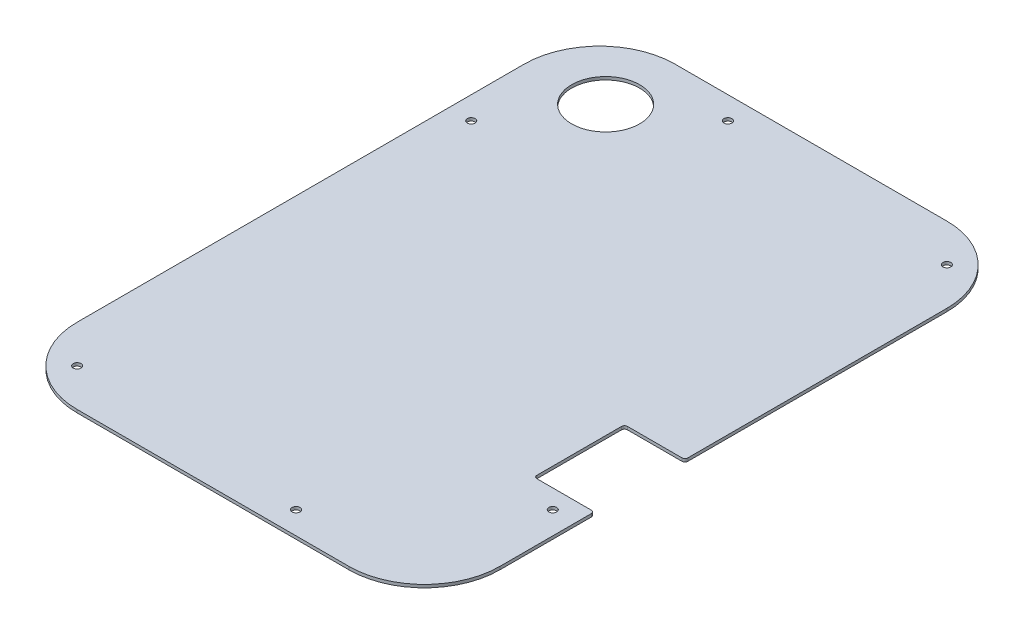
ISO-10303-21;
HEADER;
FILE_DESCRIPTION(('STEP AP214'),'2;1');
FILE_NAME('part.step','',(''),(''),'','','');
FILE_SCHEMA(('AUTOMOTIVE_DESIGN { 1 0 10303 214 1 1 1 1 }'));
ENDSEC;
DATA;
#1=APPLICATION_CONTEXT('core data for automotive mechanical design processes');
#2=APPLICATION_PROTOCOL_DEFINITION('international standard','automotive_design',2000,#1);
#3=PRODUCT_CONTEXT('',#1,'mechanical');
#4=PRODUCT('Part','Part','',(#3));
#5=PRODUCT_RELATED_PRODUCT_CATEGORY('part','',(#4));
#6=PRODUCT_DEFINITION_FORMATION('','',#4);
#7=PRODUCT_DEFINITION_CONTEXT('part definition',#1,'design');
#8=PRODUCT_DEFINITION('design','',#6,#7);
#9=PRODUCT_DEFINITION_SHAPE('','',#8);
#10=(LENGTH_UNIT() NAMED_UNIT(*) SI_UNIT(.MILLI.,.METRE.));
#11=(NAMED_UNIT(*) PLANE_ANGLE_UNIT() SI_UNIT($,.RADIAN.));
#12=(NAMED_UNIT(*) SI_UNIT($,.STERADIAN.) SOLID_ANGLE_UNIT());
#13=UNCERTAINTY_MEASURE_WITH_UNIT(LENGTH_MEASURE(1.E-05),#10,'distance_accuracy_value','');
#14=(GEOMETRIC_REPRESENTATION_CONTEXT(3) GLOBAL_UNCERTAINTY_ASSIGNED_CONTEXT((#13)) GLOBAL_UNIT_ASSIGNED_CONTEXT((#10,
#11,#12)) REPRESENTATION_CONTEXT('',''));
#15=CARTESIAN_POINT('',(0.,0.,0.));
#16=DIRECTION('',(0.,0.,1.));
#17=DIRECTION('',(1.,0.,0.));
#18=AXIS2_PLACEMENT_3D('',#15,#16,#17);
#19=CARTESIAN_POINT('',(140.,-2.,-198.));
#20=DIRECTION('',(1.,0.,0.));
#21=DIRECTION('',(0.,0.,-1.));
#22=AXIS2_PLACEMENT_3D('',#19,#20,#21);
#23=PLANE('',#22);
#24=DIRECTION('',(0.,0.,-1.));
#25=VECTOR('',#24,1.);
#26=CARTESIAN_POINT('',(140.,0.,-198.));
#27=LINE('',#26,#25);
#28=CARTESIAN_POINT('',(140.,0.,23.5000000000001));
#29=VERTEX_POINT('',#28);
#30=CARTESIAN_POINT('',(140.,0.,-148.));
#31=VERTEX_POINT('',#30);
#32=EDGE_CURVE('E154',#29,#31,#27,.T.);
#33=ORIENTED_EDGE('',*,*,#32,.F.);
#34=DIRECTION('',(0.,1.,0.));
#35=VECTOR('',#34,1.);
#36=CARTESIAN_POINT('',(140.,-2.,23.5000000000001));
#37=LINE('',#36,#35);
#38=CARTESIAN_POINT('',(140.,-2.,23.5000000000001));
#39=VERTEX_POINT('',#38);
#40=EDGE_CURVE('E53',#29,#39,#37,.F.);
#41=ORIENTED_EDGE('',*,*,#40,.T.);
#42=DIRECTION('',(0.,0.,-1.));
#43=VECTOR('',#42,1.);
#44=CARTESIAN_POINT('',(140.,-2.,-198.));
#45=LINE('',#44,#43);
#46=CARTESIAN_POINT('',(140.,-2.,-148.));
#47=VERTEX_POINT('',#46);
#48=EDGE_CURVE('E324',#39,#47,#45,.T.);
#49=ORIENTED_EDGE('',*,*,#48,.T.);
#50=DIRECTION('',(0.,1.,0.));
#51=VECTOR('',#50,1.);
#52=CARTESIAN_POINT('',(140.,-2.,-148.));
#53=LINE('',#52,#51);
#54=EDGE_CURVE('E202',#47,#31,#53,.T.);
#55=ORIENTED_EDGE('',*,*,#54,.T.);
#56=EDGE_LOOP('',(#33,#41,#49,#55));
#57=FACE_BOUND('',#56,.T.);
#58=ADVANCED_FACE('F38',(#57),#23,.T.);
#59=CARTESIAN_POINT('',(-140.,-2.,-198.));
#60=DIRECTION('',(-1.,0.,0.));
#61=DIRECTION('',(0.,0.,1.));
#62=AXIS2_PLACEMENT_3D('',#59,#60,#61);
#63=PLANE('',#62);
#64=DIRECTION('',(0.,0.,1.));
#65=VECTOR('',#64,1.);
#66=CARTESIAN_POINT('',(-140.,0.,-198.));
#67=LINE('',#66,#65);
#68=CARTESIAN_POINT('',(-140.,0.,-148.));
#69=VERTEX_POINT('',#68);
#70=CARTESIAN_POINT('',(-140.,0.,148.));
#71=VERTEX_POINT('',#70);
#72=EDGE_CURVE('E316',#69,#71,#67,.T.);
#73=ORIENTED_EDGE('',*,*,#72,.F.);
#74=DIRECTION('',(0.,1.,0.));
#75=VECTOR('',#74,1.);
#76=CARTESIAN_POINT('',(-140.,-2.,-148.));
#77=LINE('',#76,#75);
#78=CARTESIAN_POINT('',(-140.,-2.,-148.));
#79=VERTEX_POINT('',#78);
#80=EDGE_CURVE('E191',#69,#79,#77,.F.);
#81=ORIENTED_EDGE('',*,*,#80,.T.);
#82=DIRECTION('',(0.,0.,1.));
#83=VECTOR('',#82,1.);
#84=CARTESIAN_POINT('',(-140.,-2.,-198.));
#85=LINE('',#84,#83);
#86=CARTESIAN_POINT('',(-140.,-2.,148.));
#87=VERTEX_POINT('',#86);
#88=EDGE_CURVE('E170',#79,#87,#85,.T.);
#89=ORIENTED_EDGE('',*,*,#88,.T.);
#90=DIRECTION('',(0.,1.,0.));
#91=VECTOR('',#90,1.);
#92=CARTESIAN_POINT('',(-140.,-2.,148.));
#93=LINE('',#92,#91);
#94=EDGE_CURVE('E188',#87,#71,#93,.T.);
#95=ORIENTED_EDGE('',*,*,#94,.T.);
#96=EDGE_LOOP('',(#73,#81,#89,#95));
#97=FACE_BOUND('',#96,.T.);
#98=ADVANCED_FACE('F354',(#97),#63,.T.);
#99=CARTESIAN_POINT('',(140.,-2.,-198.));
#100=DIRECTION('',(0.,0.,-1.));
#101=DIRECTION('',(-1.,0.,0.));
#102=AXIS2_PLACEMENT_3D('',#99,#100,#101);
#103=PLANE('',#102);
#104=DIRECTION('',(-1.,0.,0.));
#105=VECTOR('',#104,1.);
#106=CARTESIAN_POINT('',(140.,-2.,-198.));
#107=LINE('',#106,#105);
#108=CARTESIAN_POINT('',(90.,-2.,-198.));
#109=VERTEX_POINT('',#108);
#110=CARTESIAN_POINT('',(-90.0000000000001,-2.,-198.));
#111=VERTEX_POINT('',#110);
#112=EDGE_CURVE('E177',#109,#111,#107,.T.);
#113=ORIENTED_EDGE('',*,*,#112,.T.);
#114=DIRECTION('',(0.,1.,0.));
#115=VECTOR('',#114,1.);
#116=CARTESIAN_POINT('',(-90.0000000000001,-2.,-198.));
#117=LINE('',#116,#115);
#118=CARTESIAN_POINT('',(-90.0000000000001,0.,-198.));
#119=VERTEX_POINT('',#118);
#120=EDGE_CURVE('E169',#111,#119,#117,.T.);
#121=ORIENTED_EDGE('',*,*,#120,.T.);
#122=DIRECTION('',(-1.,0.,0.));
#123=VECTOR('',#122,1.);
#124=CARTESIAN_POINT('',(140.,0.,-198.));
#125=LINE('',#124,#123);
#126=CARTESIAN_POINT('',(90.,0.,-198.));
#127=VERTEX_POINT('',#126);
#128=EDGE_CURVE('E153',#127,#119,#125,.T.);
#129=ORIENTED_EDGE('',*,*,#128,.F.);
#130=DIRECTION('',(0.,1.,0.));
#131=VECTOR('',#130,1.);
#132=CARTESIAN_POINT('',(90.,-2.,-198.));
#133=LINE('',#132,#131);
#134=EDGE_CURVE('E166',#127,#109,#133,.F.);
#135=ORIENTED_EDGE('',*,*,#134,.T.);
#136=EDGE_LOOP('',(#113,#121,#129,#135));
#137=FACE_BOUND('',#136,.T.);
#138=ADVANCED_FACE('F165',(#137),#103,.T.);
#139=CARTESIAN_POINT('',(140.,-2.,148.));
#140=VERTEX_POINT('',#139);
#141=CARTESIAN_POINT('',(140.,-2.,87.5000000000001));
#142=VERTEX_POINT('',#141);
#143=EDGE_CURVE('E181',#140,#142,#45,.T.);
#144=ORIENTED_EDGE('',*,*,#143,.T.);
#145=DIRECTION('',(0.,1.,0.));
#146=VECTOR('',#145,1.);
#147=CARTESIAN_POINT('',(140.,0.,87.5000000000001));
#148=LINE('',#147,#146);
#149=CARTESIAN_POINT('',(140.,0.,87.5000000000001));
#150=VERTEX_POINT('',#149);
#151=EDGE_CURVE('E224',#142,#150,#148,.T.);
#152=ORIENTED_EDGE('',*,*,#151,.T.);
#153=CARTESIAN_POINT('',(140.,0.,148.));
#154=VERTEX_POINT('',#153);
#155=EDGE_CURVE('E171',#154,#150,#27,.T.);
#156=ORIENTED_EDGE('',*,*,#155,.F.);
#157=DIRECTION('',(0.,1.,0.));
#158=VECTOR('',#157,1.);
#159=CARTESIAN_POINT('',(140.,-2.,148.));
#160=LINE('',#159,#158);
#161=EDGE_CURVE('E200',#154,#140,#160,.F.);
#162=ORIENTED_EDGE('',*,*,#161,.T.);
#163=EDGE_LOOP('',(#144,#152,#156,#162));
#164=FACE_BOUND('',#163,.T.);
#165=ADVANCED_FACE('F334',(#164),#23,.T.);
#166=CARTESIAN_POINT('',(140.,-2.,198.));
#167=DIRECTION('',(0.,0.,1.));
#168=DIRECTION('',(1.,0.,0.));
#169=AXIS2_PLACEMENT_3D('',#166,#167,#168);
#170=PLANE('',#169);
#171=DIRECTION('',(1.,0.,0.));
#172=VECTOR('',#171,1.);
#173=CARTESIAN_POINT('',(140.,-2.,198.));
#174=LINE('',#173,#172);
#175=CARTESIAN_POINT('',(-90.,-2.,198.));
#176=VERTEX_POINT('',#175);
#177=CARTESIAN_POINT('',(90.,-2.,198.));
#178=VERTEX_POINT('',#177);
#179=EDGE_CURVE('E321',#176,#178,#174,.T.);
#180=ORIENTED_EDGE('',*,*,#179,.T.);
#181=DIRECTION('',(0.,1.,0.));
#182=VECTOR('',#181,1.);
#183=CARTESIAN_POINT('',(90.,-2.,198.));
#184=LINE('',#183,#182);
#185=CARTESIAN_POINT('',(90.,0.,198.));
#186=VERTEX_POINT('',#185);
#187=EDGE_CURVE('E206',#178,#186,#184,.T.);
#188=ORIENTED_EDGE('',*,*,#187,.T.);
#189=DIRECTION('',(1.,0.,0.));
#190=VECTOR('',#189,1.);
#191=CARTESIAN_POINT('',(140.,0.,198.));
#192=LINE('',#191,#190);
#193=CARTESIAN_POINT('',(-90.,0.,198.));
#194=VERTEX_POINT('',#193);
#195=EDGE_CURVE('E329',#194,#186,#192,.T.);
#196=ORIENTED_EDGE('',*,*,#195,.F.);
#197=DIRECTION('',(0.,1.,0.));
#198=VECTOR('',#197,1.);
#199=CARTESIAN_POINT('',(-90.,-2.,198.));
#200=LINE('',#199,#198);
#201=EDGE_CURVE('E204',#194,#176,#200,.F.);
#202=ORIENTED_EDGE('',*,*,#201,.T.);
#203=EDGE_LOOP('',(#180,#188,#196,#202));
#204=FACE_BOUND('',#203,.T.);
#205=ADVANCED_FACE('F344',(#204),#170,.T.);
#206=CARTESIAN_POINT('',(0.,-2.,0.));
#207=DIRECTION('',(0.,-1.,0.));
#208=DIRECTION('',(0.,0.,-1.));
#209=AXIS2_PLACEMENT_3D('',#206,#207,#208);
#210=PLANE('',#209);
#211=DIRECTION('',(1.,0.,0.));
#212=VECTOR('',#211,1.);
#213=CARTESIAN_POINT('',(140.,-2.,85.5000000000001));
#214=LINE('',#213,#212);
#215=CARTESIAN_POINT('',(102.,-2.,85.5000000000001));
#216=VERTEX_POINT('',#215);
#217=CARTESIAN_POINT('',(138.,-2.,85.5000000000001));
#218=VERTEX_POINT('',#217);
#219=EDGE_CURVE('E260',#216,#218,#214,.T.);
#220=ORIENTED_EDGE('',*,*,#219,.T.);
#221=CARTESIAN_POINT('',(138.,-2.,87.5000000000001));
#222=DIRECTION('',(0.,-1.,0.));
#223=DIRECTION('',(0.,0.,-1.));
#224=AXIS2_PLACEMENT_3D('',#221,#222,#223);
#225=CIRCLE('',#224,2.);
#226=EDGE_CURVE('E232',#218,#142,#225,.T.);
#227=ORIENTED_EDGE('',*,*,#226,.T.);
#228=ORIENTED_EDGE('',*,*,#143,.F.);
#229=CARTESIAN_POINT('',(90.,-2.,148.));
#230=DIRECTION('',(0.,-1.,0.));
#231=DIRECTION('',(0.,0.,-1.));
#232=AXIS2_PLACEMENT_3D('',#229,#230,#231);
#233=CIRCLE('',#232,50.);
#234=EDGE_CURVE('E195',#140,#178,#233,.T.);
#235=ORIENTED_EDGE('',*,*,#234,.T.);
#236=ORIENTED_EDGE('',*,*,#179,.F.);
#237=CARTESIAN_POINT('',(-90.,-2.,148.));
#238=DIRECTION('',(0.,-1.,0.));
#239=DIRECTION('',(0.,0.,-1.));
#240=AXIS2_PLACEMENT_3D('',#237,#238,#239);
#241=CIRCLE('',#240,50.);
#242=EDGE_CURVE('E193',#176,#87,#241,.T.);
#243=ORIENTED_EDGE('',*,*,#242,.T.);
#244=ORIENTED_EDGE('',*,*,#88,.F.);
#245=CARTESIAN_POINT('',(-90.0000000000001,-2.,-148.));
#246=DIRECTION('',(0.,-1.,0.));
#247=DIRECTION('',(0.,0.,-1.));
#248=AXIS2_PLACEMENT_3D('',#245,#246,#247);
#249=CIRCLE('',#248,50.);
#250=EDGE_CURVE('E198',#79,#111,#249,.T.);
#251=ORIENTED_EDGE('',*,*,#250,.T.);
#252=ORIENTED_EDGE('',*,*,#112,.F.);
#253=CARTESIAN_POINT('',(90.,-2.,-148.));
#254=DIRECTION('',(0.,-1.,0.));
#255=DIRECTION('',(0.,0.,-1.));
#256=AXIS2_PLACEMENT_3D('',#253,#254,#255);
#257=CIRCLE('',#256,50.);
#258=EDGE_CURVE('E176',#109,#47,#257,.T.);
#259=ORIENTED_EDGE('',*,*,#258,.T.);
#260=ORIENTED_EDGE('',*,*,#48,.F.);
#261=CARTESIAN_POINT('',(138.,-2.,23.5000000000001));
#262=DIRECTION('',(0.,-1.,0.));
#263=DIRECTION('',(0.,0.,-1.));
#264=AXIS2_PLACEMENT_3D('',#261,#262,#263);
#265=CIRCLE('',#264,2.);
#266=CARTESIAN_POINT('',(138.,-2.,25.5000000000001));
#267=VERTEX_POINT('',#266);
#268=EDGE_CURVE('E230',#39,#267,#265,.T.);
#269=ORIENTED_EDGE('',*,*,#268,.T.);
#270=DIRECTION('',(-1.,0.,0.));
#271=VECTOR('',#270,1.);
#272=CARTESIAN_POINT('',(140.,-2.,25.5000000000001));
#273=LINE('',#272,#271);
#274=CARTESIAN_POINT('',(102.,-2.,25.5000000000001));
#275=VERTEX_POINT('',#274);
#276=EDGE_CURVE('E266',#267,#275,#273,.T.);
#277=ORIENTED_EDGE('',*,*,#276,.T.);
#278=CARTESIAN_POINT('',(102.,-2.,27.5000000000001));
#279=DIRECTION('',(0.,-1.,0.));
#280=DIRECTION('',(0.,0.,-1.));
#281=AXIS2_PLACEMENT_3D('',#278,#279,#280);
#282=CIRCLE('',#281,2.);
#283=CARTESIAN_POINT('',(100.,-2.,27.5000000000001));
#284=VERTEX_POINT('',#283);
#285=EDGE_CURVE('E237',#275,#284,#282,.F.);
#286=ORIENTED_EDGE('',*,*,#285,.T.);
#287=DIRECTION('',(0.,0.,1.));
#288=VECTOR('',#287,1.);
#289=CARTESIAN_POINT('',(100.,-2.,25.5000000000001));
#290=LINE('',#289,#288);
#291=CARTESIAN_POINT('',(100.,-2.,83.5000000000001));
#292=VERTEX_POINT('',#291);
#293=EDGE_CURVE('E262',#284,#292,#290,.T.);
#294=ORIENTED_EDGE('',*,*,#293,.T.);
#295=CARTESIAN_POINT('',(102.,-2.,83.5000000000001));
#296=DIRECTION('',(0.,-1.,0.));
#297=DIRECTION('',(0.,0.,-1.));
#298=AXIS2_PLACEMENT_3D('',#295,#296,#297);
#299=CIRCLE('',#298,2.);
#300=EDGE_CURVE('E11',#292,#216,#299,.F.);
#301=ORIENTED_EDGE('',*,*,#300,.T.);
#302=EDGE_LOOP('',(#220,#227,#228,#235,#236,#243,#244,#251,#252,#259,#260,#269,#277,#286,#294,#301));
#303=FACE_BOUND('',#302,.T.);
#304=CARTESIAN_POINT('',(115.,-2.,-173.));
#305=DIRECTION('',(0.,1.,0.));
#306=DIRECTION('',(0.,0.,1.));
#307=AXIS2_PLACEMENT_3D('',#304,#305,#306);
#308=CIRCLE('',#307,2.6);
#309=CARTESIAN_POINT('',(115.,-2.,-170.4));
#310=VERTEX_POINT('',#309);
#311=EDGE_CURVE('E290',#310,#310,#308,.T.);
#312=ORIENTED_EDGE('',*,*,#311,.T.);
#313=EDGE_LOOP('',(#312));
#314=FACE_BOUND('',#313,.T.);
#315=CARTESIAN_POINT('',(-115.,-2.,173.));
#316=DIRECTION('',(0.,1.,0.));
#317=DIRECTION('',(0.,0.,1.));
#318=AXIS2_PLACEMENT_3D('',#315,#316,#317);
#319=CIRCLE('',#318,2.6);
#320=CARTESIAN_POINT('',(-115.,-2.,175.6));
#321=VERTEX_POINT('',#320);
#322=EDGE_CURVE('E284',#321,#321,#319,.T.);
#323=ORIENTED_EDGE('',*,*,#322,.T.);
#324=EDGE_LOOP('',(#323));
#325=FACE_BOUND('',#324,.T.);
#326=CARTESIAN_POINT('',(40.,-2.,183.));
#327=DIRECTION('',(0.,1.,0.));
#328=DIRECTION('',(0.,0.,1.));
#329=AXIS2_PLACEMENT_3D('',#326,#327,#328);
#330=CIRCLE('',#329,2.59999999999999);
#331=CARTESIAN_POINT('',(40.,-2.,185.6));
#332=VERTEX_POINT('',#331);
#333=EDGE_CURVE('E277',#332,#332,#330,.T.);
#334=ORIENTED_EDGE('',*,*,#333,.T.);
#335=EDGE_LOOP('',(#334));
#336=FACE_BOUND('',#335,.T.);
#337=CARTESIAN_POINT('',(125.,-2.,98.0000000000001));
#338=DIRECTION('',(0.,1.,0.));
#339=DIRECTION('',(0.,0.,1.));
#340=AXIS2_PLACEMENT_3D('',#337,#338,#339);
#341=CIRCLE('',#340,2.59999999999999);
#342=CARTESIAN_POINT('',(125.,-2.,100.6));
#343=VERTEX_POINT('',#342);
#344=EDGE_CURVE('E302',#343,#343,#341,.T.);
#345=ORIENTED_EDGE('',*,*,#344,.T.);
#346=EDGE_LOOP('',(#345));
#347=FACE_BOUND('',#346,.T.);
#348=CARTESIAN_POINT('',(-125.,-2.,-98.));
#349=DIRECTION('',(0.,1.,0.));
#350=DIRECTION('',(0.,0.,1.));
#351=AXIS2_PLACEMENT_3D('',#348,#349,#350);
#352=CIRCLE('',#351,2.6);
#353=CARTESIAN_POINT('',(-125.,-2.,-95.4));
#354=VERTEX_POINT('',#353);
#355=EDGE_CURVE('E295',#354,#354,#352,.T.);
#356=ORIENTED_EDGE('',*,*,#355,.T.);
#357=EDGE_LOOP('',(#356));
#358=FACE_BOUND('',#357,.T.);
#359=CARTESIAN_POINT('',(-40.0000000000001,-2.,-183.));
#360=DIRECTION('',(0.,1.,0.));
#361=DIRECTION('',(0.,0.,1.));
#362=AXIS2_PLACEMENT_3D('',#359,#360,#361);
#363=CIRCLE('',#362,2.59999999999999);
#364=CARTESIAN_POINT('',(-40.0000000000001,-2.,-180.4));
#365=VERTEX_POINT('',#364);
#366=EDGE_CURVE('E307',#365,#365,#363,.T.);
#367=ORIENTED_EDGE('',*,*,#366,.T.);
#368=EDGE_LOOP('',(#367));
#369=FACE_BOUND('',#368,.T.);
#370=CARTESIAN_POINT('',(-90.0000000000001,-2.,-152.));
#371=DIRECTION('',(0.,1.,0.));
#372=DIRECTION('',(0.,0.,1.));
#373=AXIS2_PLACEMENT_3D('',#370,#371,#372);
#374=CIRCLE('',#373,22.5);
#375=CARTESIAN_POINT('',(-90.0000000000001,-2.,-129.5));
#376=VERTEX_POINT('',#375);
#377=EDGE_CURVE('E313',#376,#376,#374,.T.);
#378=ORIENTED_EDGE('',*,*,#377,.T.);
#379=EDGE_LOOP('',(#378));
#380=FACE_BOUND('',#379,.T.);
#381=ADVANCED_FACE('F258',(#303,#314,#325,#336,#347,#358,#369,#380),#210,.T.);
#382=CARTESIAN_POINT('',(0.,0.,0.));
#383=DIRECTION('',(0.,-1.,0.));
#384=DIRECTION('',(0.,0.,-1.));
#385=AXIS2_PLACEMENT_3D('',#382,#383,#384);
#386=PLANE('',#385);
#387=CARTESIAN_POINT('',(115.,0.,-173.));
#388=DIRECTION('',(0.,1.,0.));
#389=DIRECTION('',(0.,0.,1.));
#390=AXIS2_PLACEMENT_3D('',#387,#388,#389);
#391=CIRCLE('',#390,2.6);
#392=CARTESIAN_POINT('',(115.,0.,-170.4));
#393=VERTEX_POINT('',#392);
#394=EDGE_CURVE('E269',#393,#393,#391,.T.);
#395=ORIENTED_EDGE('',*,*,#394,.F.);
#396=EDGE_LOOP('',(#395));
#397=FACE_BOUND('',#396,.T.);
#398=CARTESIAN_POINT('',(-115.,0.,173.));
#399=DIRECTION('',(0.,1.,0.));
#400=DIRECTION('',(0.,0.,1.));
#401=AXIS2_PLACEMENT_3D('',#398,#399,#400);
#402=CIRCLE('',#401,2.6);
#403=CARTESIAN_POINT('',(-115.,0.,175.6));
#404=VERTEX_POINT('',#403);
#405=EDGE_CURVE('E287',#404,#404,#402,.T.);
#406=ORIENTED_EDGE('',*,*,#405,.F.);
#407=EDGE_LOOP('',(#406));
#408=FACE_BOUND('',#407,.T.);
#409=CARTESIAN_POINT('',(40.,0.,183.));
#410=DIRECTION('',(0.,1.,0.));
#411=DIRECTION('',(0.,0.,1.));
#412=AXIS2_PLACEMENT_3D('',#409,#410,#411);
#413=CIRCLE('',#412,2.59999999999999);
#414=CARTESIAN_POINT('',(40.,0.,185.6));
#415=VERTEX_POINT('',#414);
#416=EDGE_CURVE('E281',#415,#415,#413,.T.);
#417=ORIENTED_EDGE('',*,*,#416,.F.);
#418=EDGE_LOOP('',(#417));
#419=FACE_BOUND('',#418,.T.);
#420=CARTESIAN_POINT('',(125.,0.,98.0000000000001));
#421=DIRECTION('',(0.,1.,0.));
#422=DIRECTION('',(0.,0.,1.));
#423=AXIS2_PLACEMENT_3D('',#420,#421,#422);
#424=CIRCLE('',#423,2.59999999999999);
#425=CARTESIAN_POINT('',(125.,0.,100.6));
#426=VERTEX_POINT('',#425);
#427=EDGE_CURVE('E280',#426,#426,#424,.T.);
#428=ORIENTED_EDGE('',*,*,#427,.F.);
#429=EDGE_LOOP('',(#428));
#430=FACE_BOUND('',#429,.T.);
#431=CARTESIAN_POINT('',(-125.,0.,-98.));
#432=DIRECTION('',(0.,1.,0.));
#433=DIRECTION('',(0.,0.,1.));
#434=AXIS2_PLACEMENT_3D('',#431,#432,#433);
#435=CIRCLE('',#434,2.6);
#436=CARTESIAN_POINT('',(-125.,0.,-95.4));
#437=VERTEX_POINT('',#436);
#438=EDGE_CURVE('E299',#437,#437,#435,.T.);
#439=ORIENTED_EDGE('',*,*,#438,.F.);
#440=EDGE_LOOP('',(#439));
#441=FACE_BOUND('',#440,.T.);
#442=CARTESIAN_POINT('',(-40.0000000000001,0.,-183.));
#443=DIRECTION('',(0.,1.,0.));
#444=DIRECTION('',(0.,0.,1.));
#445=AXIS2_PLACEMENT_3D('',#442,#443,#444);
#446=CIRCLE('',#445,2.59999999999999);
#447=CARTESIAN_POINT('',(-40.0000000000001,0.,-180.4));
#448=VERTEX_POINT('',#447);
#449=EDGE_CURVE('E298',#448,#448,#446,.T.);
#450=ORIENTED_EDGE('',*,*,#449,.F.);
#451=EDGE_LOOP('',(#450));
#452=FACE_BOUND('',#451,.T.);
#453=CARTESIAN_POINT('',(-90.0000000000001,0.,-152.));
#454=DIRECTION('',(0.,1.,0.));
#455=DIRECTION('',(0.,0.,1.));
#456=AXIS2_PLACEMENT_3D('',#453,#454,#455);
#457=CIRCLE('',#456,22.5);
#458=CARTESIAN_POINT('',(-90.0000000000001,0.,-129.5));
#459=VERTEX_POINT('',#458);
#460=EDGE_CURVE('E310',#459,#459,#457,.T.);
#461=ORIENTED_EDGE('',*,*,#460,.F.);
#462=EDGE_LOOP('',(#461));
#463=FACE_BOUND('',#462,.T.);
#464=ORIENTED_EDGE('',*,*,#155,.T.);
#465=CARTESIAN_POINT('',(138.,0.,87.5000000000001));
#466=DIRECTION('',(0.,-1.,0.));
#467=DIRECTION('',(0.,0.,-1.));
#468=AXIS2_PLACEMENT_3D('',#465,#466,#467);
#469=CIRCLE('',#468,2.);
#470=CARTESIAN_POINT('',(138.,0.,85.5000000000001));
#471=VERTEX_POINT('',#470);
#472=EDGE_CURVE('E228',#150,#471,#469,.F.);
#473=ORIENTED_EDGE('',*,*,#472,.T.);
#474=DIRECTION('',(1.,0.,0.));
#475=VECTOR('',#474,1.);
#476=CARTESIAN_POINT('',(140.,0.,85.5000000000001));
#477=LINE('',#476,#475);
#478=CARTESIAN_POINT('',(102.,0.,85.5000000000001));
#479=VERTEX_POINT('',#478);
#480=EDGE_CURVE('E243',#479,#471,#477,.T.);
#481=ORIENTED_EDGE('',*,*,#480,.F.);
#482=CARTESIAN_POINT('',(102.,0.,83.5000000000001));
#483=DIRECTION('',(0.,-1.,0.));
#484=DIRECTION('',(0.,0.,-1.));
#485=AXIS2_PLACEMENT_3D('',#482,#483,#484);
#486=CIRCLE('',#485,2.);
#487=CARTESIAN_POINT('',(100.,0.,83.5000000000001));
#488=VERTEX_POINT('',#487);
#489=EDGE_CURVE('E46',#479,#488,#486,.T.);
#490=ORIENTED_EDGE('',*,*,#489,.T.);
#491=DIRECTION('',(0.,0.,1.));
#492=VECTOR('',#491,1.);
#493=CARTESIAN_POINT('',(100.,0.,25.5000000000001));
#494=LINE('',#493,#492);
#495=CARTESIAN_POINT('',(100.,0.,27.5000000000001));
#496=VERTEX_POINT('',#495);
#497=EDGE_CURVE('E241',#496,#488,#494,.T.);
#498=ORIENTED_EDGE('',*,*,#497,.F.);
#499=CARTESIAN_POINT('',(102.,0.,27.5000000000001));
#500=DIRECTION('',(0.,-1.,0.));
#501=DIRECTION('',(0.,0.,-1.));
#502=AXIS2_PLACEMENT_3D('',#499,#500,#501);
#503=CIRCLE('',#502,2.);
#504=CARTESIAN_POINT('',(102.,0.,25.5000000000001));
#505=VERTEX_POINT('',#504);
#506=EDGE_CURVE('E235',#496,#505,#503,.T.);
#507=ORIENTED_EDGE('',*,*,#506,.T.);
#508=DIRECTION('',(-1.,0.,0.));
#509=VECTOR('',#508,1.);
#510=CARTESIAN_POINT('',(140.,0.,25.5000000000001));
#511=LINE('',#510,#509);
#512=CARTESIAN_POINT('',(138.,0.,25.5000000000001));
#513=VERTEX_POINT('',#512);
#514=EDGE_CURVE('E271',#513,#505,#511,.T.);
#515=ORIENTED_EDGE('',*,*,#514,.F.);
#516=CARTESIAN_POINT('',(138.,0.,23.5000000000001));
#517=DIRECTION('',(0.,-1.,0.));
#518=DIRECTION('',(0.,0.,-1.));
#519=AXIS2_PLACEMENT_3D('',#516,#517,#518);
#520=CIRCLE('',#519,2.);
#521=EDGE_CURVE('E61',#513,#29,#520,.F.);
#522=ORIENTED_EDGE('',*,*,#521,.T.);
#523=ORIENTED_EDGE('',*,*,#32,.T.);
#524=CARTESIAN_POINT('',(90.,0.,-148.));
#525=DIRECTION('',(0.,-1.,0.));
#526=DIRECTION('',(0.,0.,-1.));
#527=AXIS2_PLACEMENT_3D('',#524,#525,#526);
#528=CIRCLE('',#527,50.);
#529=EDGE_CURVE('E149',#31,#127,#528,.F.);
#530=ORIENTED_EDGE('',*,*,#529,.T.);
#531=ORIENTED_EDGE('',*,*,#128,.T.);
#532=CARTESIAN_POINT('',(-90.0000000000001,0.,-148.));
#533=DIRECTION('',(0.,-1.,0.));
#534=DIRECTION('',(0.,0.,-1.));
#535=AXIS2_PLACEMENT_3D('',#532,#533,#534);
#536=CIRCLE('',#535,50.);
#537=EDGE_CURVE('E159',#119,#69,#536,.F.);
#538=ORIENTED_EDGE('',*,*,#537,.T.);
#539=ORIENTED_EDGE('',*,*,#72,.T.);
#540=CARTESIAN_POINT('',(-90.,0.,148.));
#541=DIRECTION('',(0.,-1.,0.));
#542=DIRECTION('',(0.,0.,-1.));
#543=AXIS2_PLACEMENT_3D('',#540,#541,#542);
#544=CIRCLE('',#543,50.);
#545=EDGE_CURVE('E179',#71,#194,#544,.F.);
#546=ORIENTED_EDGE('',*,*,#545,.T.);
#547=ORIENTED_EDGE('',*,*,#195,.T.);
#548=CARTESIAN_POINT('',(90.,0.,148.));
#549=DIRECTION('',(0.,-1.,0.));
#550=DIRECTION('',(0.,0.,-1.));
#551=AXIS2_PLACEMENT_3D('',#548,#549,#550);
#552=CIRCLE('',#551,50.);
#553=EDGE_CURVE('E160',#186,#154,#552,.F.);
#554=ORIENTED_EDGE('',*,*,#553,.T.);
#555=EDGE_LOOP('',(#464,#473,#481,#490,#498,#507,#515,#522,#523,#530,#531,#538,#539,#546,#547,#554));
#556=FACE_BOUND('',#555,.T.);
#557=ADVANCED_FACE('F152',(#397,#408,#419,#430,#441,#452,#463,#556),#386,.F.);
#558=CARTESIAN_POINT('',(-90.0000000000001,-2.,-148.));
#559=DIRECTION('',(0.,1.,0.));
#560=DIRECTION('',(0.,0.,1.));
#561=AXIS2_PLACEMENT_3D('',#558,#559,#560);
#562=CYLINDRICAL_SURFACE('',#561,50.);
#563=ORIENTED_EDGE('',*,*,#250,.F.);
#564=ORIENTED_EDGE('',*,*,#80,.F.);
#565=ORIENTED_EDGE('',*,*,#537,.F.);
#566=ORIENTED_EDGE('',*,*,#120,.F.);
#567=EDGE_LOOP('',(#563,#564,#565,#566));
#568=FACE_BOUND('',#567,.T.);
#569=ADVANCED_FACE('F357',(#568),#562,.T.);
#570=CARTESIAN_POINT('',(90.,-2.,-148.));
#571=DIRECTION('',(0.,1.,0.));
#572=DIRECTION('',(0.,0.,1.));
#573=AXIS2_PLACEMENT_3D('',#570,#571,#572);
#574=CYLINDRICAL_SURFACE('',#573,50.);
#575=ORIENTED_EDGE('',*,*,#258,.F.);
#576=ORIENTED_EDGE('',*,*,#134,.F.);
#577=ORIENTED_EDGE('',*,*,#529,.F.);
#578=ORIENTED_EDGE('',*,*,#54,.F.);
#579=EDGE_LOOP('',(#575,#576,#577,#578));
#580=FACE_BOUND('',#579,.T.);
#581=ADVANCED_FACE('F174',(#580),#574,.T.);
#582=CARTESIAN_POINT('',(90.,-2.,148.));
#583=DIRECTION('',(0.,1.,0.));
#584=DIRECTION('',(0.,0.,1.));
#585=AXIS2_PLACEMENT_3D('',#582,#583,#584);
#586=CYLINDRICAL_SURFACE('',#585,50.);
#587=ORIENTED_EDGE('',*,*,#234,.F.);
#588=ORIENTED_EDGE('',*,*,#161,.F.);
#589=ORIENTED_EDGE('',*,*,#553,.F.);
#590=ORIENTED_EDGE('',*,*,#187,.F.);
#591=EDGE_LOOP('',(#587,#588,#589,#590));
#592=FACE_BOUND('',#591,.T.);
#593=ADVANCED_FACE('F339',(#592),#586,.T.);
#594=CARTESIAN_POINT('',(-90.,-2.,148.));
#595=DIRECTION('',(0.,1.,0.));
#596=DIRECTION('',(0.,0.,1.));
#597=AXIS2_PLACEMENT_3D('',#594,#595,#596);
#598=CYLINDRICAL_SURFACE('',#597,50.);
#599=ORIENTED_EDGE('',*,*,#242,.F.);
#600=ORIENTED_EDGE('',*,*,#201,.F.);
#601=ORIENTED_EDGE('',*,*,#545,.F.);
#602=ORIENTED_EDGE('',*,*,#94,.F.);
#603=EDGE_LOOP('',(#599,#600,#601,#602));
#604=FACE_BOUND('',#603,.T.);
#605=ADVANCED_FACE('F348',(#604),#598,.T.);
#606=CARTESIAN_POINT('',(-90.0000000000001,-2.,-152.));
#607=DIRECTION('',(0.,1.,0.));
#608=DIRECTION('',(0.,0.,1.));
#609=AXIS2_PLACEMENT_3D('',#606,#607,#608);
#610=CYLINDRICAL_SURFACE('',#609,22.5);
#611=ORIENTED_EDGE('',*,*,#377,.F.);
#612=EDGE_LOOP('',(#611));
#613=FACE_BOUND('',#612,.T.);
#614=ORIENTED_EDGE('',*,*,#460,.T.);
#615=EDGE_LOOP('',(#614));
#616=FACE_BOUND('',#615,.T.);
#617=ADVANCED_FACE('F399',(#613,#616),#610,.F.);
#618=CARTESIAN_POINT('',(-40.0000000000001,-2.,-183.));
#619=DIRECTION('',(0.,1.,0.));
#620=DIRECTION('',(0.,0.,1.));
#621=AXIS2_PLACEMENT_3D('',#618,#619,#620);
#622=CYLINDRICAL_SURFACE('',#621,2.59999999999999);
#623=ORIENTED_EDGE('',*,*,#366,.F.);
#624=EDGE_LOOP('',(#623));
#625=FACE_BOUND('',#624,.T.);
#626=ORIENTED_EDGE('',*,*,#449,.T.);
#627=EDGE_LOOP('',(#626));
#628=FACE_BOUND('',#627,.T.);
#629=ADVANCED_FACE('F402',(#625,#628),#622,.F.);
#630=CARTESIAN_POINT('',(-125.,-2.,-98.));
#631=DIRECTION('',(0.,1.,0.));
#632=DIRECTION('',(0.,0.,1.));
#633=AXIS2_PLACEMENT_3D('',#630,#631,#632);
#634=CYLINDRICAL_SURFACE('',#633,2.6);
#635=ORIENTED_EDGE('',*,*,#355,.F.);
#636=EDGE_LOOP('',(#635));
#637=FACE_BOUND('',#636,.T.);
#638=ORIENTED_EDGE('',*,*,#438,.T.);
#639=EDGE_LOOP('',(#638));
#640=FACE_BOUND('',#639,.T.);
#641=ADVANCED_FACE('F406',(#637,#640),#634,.F.);
#642=CARTESIAN_POINT('',(125.,-2.,98.0000000000001));
#643=DIRECTION('',(0.,1.,0.));
#644=DIRECTION('',(0.,0.,1.));
#645=AXIS2_PLACEMENT_3D('',#642,#643,#644);
#646=CYLINDRICAL_SURFACE('',#645,2.59999999999999);
#647=ORIENTED_EDGE('',*,*,#344,.F.);
#648=EDGE_LOOP('',(#647));
#649=FACE_BOUND('',#648,.T.);
#650=ORIENTED_EDGE('',*,*,#427,.T.);
#651=EDGE_LOOP('',(#650));
#652=FACE_BOUND('',#651,.T.);
#653=ADVANCED_FACE('F408',(#649,#652),#646,.F.);
#654=CARTESIAN_POINT('',(40.,-2.,183.));
#655=DIRECTION('',(0.,1.,0.));
#656=DIRECTION('',(0.,0.,1.));
#657=AXIS2_PLACEMENT_3D('',#654,#655,#656);
#658=CYLINDRICAL_SURFACE('',#657,2.59999999999999);
#659=ORIENTED_EDGE('',*,*,#333,.F.);
#660=EDGE_LOOP('',(#659));
#661=FACE_BOUND('',#660,.T.);
#662=ORIENTED_EDGE('',*,*,#416,.T.);
#663=EDGE_LOOP('',(#662));
#664=FACE_BOUND('',#663,.T.);
#665=ADVANCED_FACE('F411',(#661,#664),#658,.F.);
#666=CARTESIAN_POINT('',(-115.,-2.,173.));
#667=DIRECTION('',(0.,1.,0.));
#668=DIRECTION('',(0.,0.,1.));
#669=AXIS2_PLACEMENT_3D('',#666,#667,#668);
#670=CYLINDRICAL_SURFACE('',#669,2.6);
#671=ORIENTED_EDGE('',*,*,#322,.F.);
#672=EDGE_LOOP('',(#671));
#673=FACE_BOUND('',#672,.T.);
#674=ORIENTED_EDGE('',*,*,#405,.T.);
#675=EDGE_LOOP('',(#674));
#676=FACE_BOUND('',#675,.T.);
#677=ADVANCED_FACE('F419',(#673,#676),#670,.F.);
#678=CARTESIAN_POINT('',(115.,-2.,-173.));
#679=DIRECTION('',(0.,1.,0.));
#680=DIRECTION('',(0.,0.,1.));
#681=AXIS2_PLACEMENT_3D('',#678,#679,#680);
#682=CYLINDRICAL_SURFACE('',#681,2.6);
#683=ORIENTED_EDGE('',*,*,#311,.F.);
#684=EDGE_LOOP('',(#683));
#685=FACE_BOUND('',#684,.T.);
#686=ORIENTED_EDGE('',*,*,#394,.T.);
#687=EDGE_LOOP('',(#686));
#688=FACE_BOUND('',#687,.T.);
#689=ADVANCED_FACE('F416',(#685,#688),#682,.F.);
#690=CARTESIAN_POINT('',(100.,-2.,25.5000000000001));
#691=DIRECTION('',(-1.,0.,0.));
#692=DIRECTION('',(0.,0.,1.));
#693=AXIS2_PLACEMENT_3D('',#690,#691,#692);
#694=PLANE('',#693);
#695=ORIENTED_EDGE('',*,*,#293,.F.);
#696=DIRECTION('',(0.,1.,0.));
#697=VECTOR('',#696,1.);
#698=CARTESIAN_POINT('',(100.,0.,27.5000000000001));
#699=LINE('',#698,#697);
#700=EDGE_CURVE('E211',#284,#496,#699,.T.);
#701=ORIENTED_EDGE('',*,*,#700,.T.);
#702=ORIENTED_EDGE('',*,*,#497,.T.);
#703=DIRECTION('',(0.,1.,0.));
#704=VECTOR('',#703,1.);
#705=CARTESIAN_POINT('',(100.,-2.,83.5000000000001));
#706=LINE('',#705,#704);
#707=EDGE_CURVE('E209',#488,#292,#706,.F.);
#708=ORIENTED_EDGE('',*,*,#707,.T.);
#709=EDGE_LOOP('',(#695,#701,#702,#708));
#710=FACE_BOUND('',#709,.T.);
#711=ADVANCED_FACE('F249',(#710),#694,.F.);
#712=CARTESIAN_POINT('',(140.,-2.,25.5000000000001));
#713=DIRECTION('',(0.,0.,-1.));
#714=DIRECTION('',(-1.,0.,0.));
#715=AXIS2_PLACEMENT_3D('',#712,#713,#714);
#716=PLANE('',#715);
#717=ORIENTED_EDGE('',*,*,#514,.T.);
#718=DIRECTION('',(0.,1.,0.));
#719=VECTOR('',#718,1.);
#720=CARTESIAN_POINT('',(102.,-2.,25.5000000000001));
#721=LINE('',#720,#719);
#722=EDGE_CURVE('E217',#505,#275,#721,.F.);
#723=ORIENTED_EDGE('',*,*,#722,.T.);
#724=ORIENTED_EDGE('',*,*,#276,.F.);
#725=DIRECTION('',(0.,1.,0.));
#726=VECTOR('',#725,1.);
#727=CARTESIAN_POINT('',(138.,0.,25.5000000000001));
#728=LINE('',#727,#726);
#729=EDGE_CURVE('E214',#267,#513,#728,.T.);
#730=ORIENTED_EDGE('',*,*,#729,.T.);
#731=EDGE_LOOP('',(#717,#723,#724,#730));
#732=FACE_BOUND('',#731,.T.);
#733=ADVANCED_FACE('F364',(#732),#716,.F.);
#734=CARTESIAN_POINT('',(140.,-2.,85.5000000000001));
#735=DIRECTION('',(0.,0.,1.));
#736=DIRECTION('',(1.,0.,0.));
#737=AXIS2_PLACEMENT_3D('',#734,#735,#736);
#738=PLANE('',#737);
#739=ORIENTED_EDGE('',*,*,#219,.F.);
#740=DIRECTION('',(0.,1.,0.));
#741=VECTOR('',#740,1.);
#742=CARTESIAN_POINT('',(102.,0.,85.5000000000001));
#743=LINE('',#742,#741);
#744=EDGE_CURVE('E221',#216,#479,#743,.T.);
#745=ORIENTED_EDGE('',*,*,#744,.T.);
#746=ORIENTED_EDGE('',*,*,#480,.T.);
#747=DIRECTION('',(0.,1.,0.));
#748=VECTOR('',#747,1.);
#749=CARTESIAN_POINT('',(138.,-2.,85.5000000000001));
#750=LINE('',#749,#748);
#751=EDGE_CURVE('E219',#471,#218,#750,.F.);
#752=ORIENTED_EDGE('',*,*,#751,.T.);
#753=EDGE_LOOP('',(#739,#745,#746,#752));
#754=FACE_BOUND('',#753,.T.);
#755=ADVANCED_FACE('F264',(#754),#738,.F.);
#756=CARTESIAN_POINT('',(102.,-2.,27.5000000000001));
#757=DIRECTION('',(0.,-1.,0.));
#758=DIRECTION('',(0.,0.,-1.));
#759=AXIS2_PLACEMENT_3D('',#756,#757,#758);
#760=CYLINDRICAL_SURFACE('',#759,2.);
#761=ORIENTED_EDGE('',*,*,#285,.F.);
#762=ORIENTED_EDGE('',*,*,#722,.F.);
#763=ORIENTED_EDGE('',*,*,#506,.F.);
#764=ORIENTED_EDGE('',*,*,#700,.F.);
#765=EDGE_LOOP('',(#761,#762,#763,#764));
#766=FACE_BOUND('',#765,.T.);
#767=ADVANCED_FACE('F367',(#766),#760,.F.);
#768=CARTESIAN_POINT('',(102.,-2.,83.5000000000001));
#769=DIRECTION('',(0.,-1.,0.));
#770=DIRECTION('',(0.,0.,-1.));
#771=AXIS2_PLACEMENT_3D('',#768,#769,#770);
#772=CYLINDRICAL_SURFACE('',#771,2.);
#773=ORIENTED_EDGE('',*,*,#300,.F.);
#774=ORIENTED_EDGE('',*,*,#707,.F.);
#775=ORIENTED_EDGE('',*,*,#489,.F.);
#776=ORIENTED_EDGE('',*,*,#744,.F.);
#777=EDGE_LOOP('',(#773,#774,#775,#776));
#778=FACE_BOUND('',#777,.T.);
#779=ADVANCED_FACE('F254',(#778),#772,.F.);
#780=CARTESIAN_POINT('',(138.,-2.,87.5000000000001));
#781=DIRECTION('',(0.,-1.,0.));
#782=DIRECTION('',(0.,0.,-1.));
#783=AXIS2_PLACEMENT_3D('',#780,#781,#782);
#784=CYLINDRICAL_SURFACE('',#783,2.);
#785=ORIENTED_EDGE('',*,*,#226,.F.);
#786=ORIENTED_EDGE('',*,*,#751,.F.);
#787=ORIENTED_EDGE('',*,*,#472,.F.);
#788=ORIENTED_EDGE('',*,*,#151,.F.);
#789=EDGE_LOOP('',(#785,#786,#787,#788));
#790=FACE_BOUND('',#789,.T.);
#791=ADVANCED_FACE('F374',(#790),#784,.T.);
#792=CARTESIAN_POINT('',(138.,-2.,23.5000000000001));
#793=DIRECTION('',(0.,-1.,0.));
#794=DIRECTION('',(0.,0.,-1.));
#795=AXIS2_PLACEMENT_3D('',#792,#793,#794);
#796=CYLINDRICAL_SURFACE('',#795,2.);
#797=ORIENTED_EDGE('',*,*,#268,.F.);
#798=ORIENTED_EDGE('',*,*,#40,.F.);
#799=ORIENTED_EDGE('',*,*,#521,.F.);
#800=ORIENTED_EDGE('',*,*,#729,.F.);
#801=EDGE_LOOP('',(#797,#798,#799,#800));
#802=FACE_BOUND('',#801,.T.);
#803=ADVANCED_FACE('F40',(#802),#796,.T.);
#804=CLOSED_SHELL('',(#58,#98,#138,#165,#205,#381,#557,#569,#581,#593,#605,#617,#629,#641,#653,
#665,#677,#689,#711,#733,#755,#767,#779,#791,#803));
#805=MANIFOLD_SOLID_BREP('B2',#804);
#806=ADVANCED_BREP_SHAPE_REPRESENTATION('',(#18,#805),#14);
#807=SHAPE_DEFINITION_REPRESENTATION(#9,#806);
ENDSEC;
END-ISO-10303-21;
